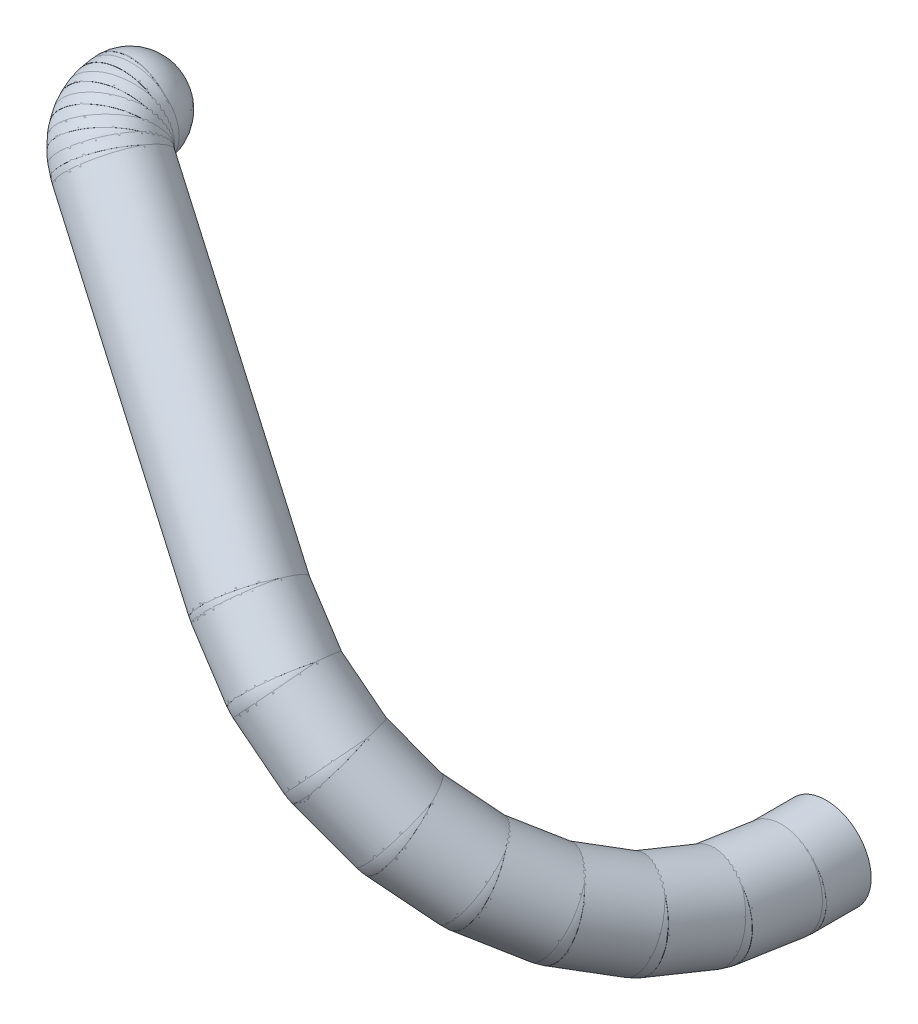
ISO-10303-21;
HEADER;
FILE_DESCRIPTION(('STEP AP214'),'2;1');
FILE_NAME('part.step','',(''),(''),'','','');
FILE_SCHEMA(('AUTOMOTIVE_DESIGN { 1 0 10303 214 1 1 1 1 }'));
ENDSEC;
DATA;
#1=APPLICATION_CONTEXT('core data for automotive mechanical design processes');
#2=APPLICATION_PROTOCOL_DEFINITION('international standard','automotive_design',2000,#1);
#3=PRODUCT_CONTEXT('',#1,'mechanical');
#4=PRODUCT('Part','Part','',(#3));
#5=PRODUCT_RELATED_PRODUCT_CATEGORY('part','',(#4));
#6=PRODUCT_DEFINITION_FORMATION('','',#4);
#7=PRODUCT_DEFINITION_CONTEXT('part definition',#1,'design');
#8=PRODUCT_DEFINITION('design','',#6,#7);
#9=PRODUCT_DEFINITION_SHAPE('','',#8);
#10=(LENGTH_UNIT() NAMED_UNIT(*) SI_UNIT(.MILLI.,.METRE.));
#11=(NAMED_UNIT(*) PLANE_ANGLE_UNIT() SI_UNIT($,.RADIAN.));
#12=(NAMED_UNIT(*) SI_UNIT($,.STERADIAN.) SOLID_ANGLE_UNIT());
#13=UNCERTAINTY_MEASURE_WITH_UNIT(LENGTH_MEASURE(1.E-05),#10,'distance_accuracy_value','');
#14=(GEOMETRIC_REPRESENTATION_CONTEXT(3) GLOBAL_UNCERTAINTY_ASSIGNED_CONTEXT((#13)) GLOBAL_UNIT_ASSIGNED_CONTEXT((#10,
#11,#12)) REPRESENTATION_CONTEXT('',''));
#15=CARTESIAN_POINT('',(0.,0.,0.));
#16=DIRECTION('',(0.,0.,1.));
#17=DIRECTION('',(1.,0.,0.));
#18=AXIS2_PLACEMENT_3D('',#15,#16,#17);
#19=CARTESIAN_POINT('',(51.3,-63.9,201.9));
#20=DIRECTION('',(0.,0.,1.));
#21=DIRECTION('',(1.,0.,0.));
#22=AXIS2_PLACEMENT_3D('',#19,#20,#21);
#23=PLANE('',#22);
#24=CARTESIAN_POINT('',(51.3,-63.9,201.9));
#25=DIRECTION('',(0.,0.,1.));
#26=DIRECTION('',(1.,0.,0.));
#27=AXIS2_PLACEMENT_3D('',#24,#25,#26);
#28=CIRCLE('',#27,2.25);
#29=CARTESIAN_POINT('',(53.55,-63.9,201.9));
#30=VERTEX_POINT('',#29);
#31=EDGE_CURVE('P0_E11',#30,#30,#28,.T.);
#32=ORIENTED_EDGE('',*,*,#31,.F.);
#33=EDGE_LOOP('',(#32));
#34=FACE_BOUND('',#33,.T.);
#35=ADVANCED_FACE('P0_F16',(#34),#23,.F.);
#36=CARTESIAN_POINT('',(51.3,-63.9,204.14956751847));
#37=DIRECTION('',(0.,0.,1.));
#38=DIRECTION('',(1.,0.,0.));
#39=AXIS2_PLACEMENT_3D('',#36,#37,#38);
#40=PLANE('',#39);
#41=CARTESIAN_POINT('',(51.3,-63.9,204.14956751847));
#42=DIRECTION('',(0.,0.,1.));
#43=DIRECTION('',(1.,0.,0.));
#44=AXIS2_PLACEMENT_3D('',#41,#42,#43);
#45=CIRCLE('',#44,2.25);
#46=CARTESIAN_POINT('',(53.55,-63.9,204.14956751847));
#47=VERTEX_POINT('',#46);
#48=EDGE_CURVE('P0_E40',#47,#47,#45,.T.);
#49=ORIENTED_EDGE('',*,*,#48,.T.);
#50=EDGE_LOOP('',(#49));
#51=FACE_BOUND('',#50,.T.);
#52=ADVANCED_FACE('P0_F43',(#51),#40,.T.);
#53=CARTESIAN_POINT('',(51.3,-63.9,201.9));
#54=DIRECTION('',(0.,0.,1.));
#55=DIRECTION('',(1.,0.,0.));
#56=AXIS2_PLACEMENT_3D('',#53,#54,#55);
#57=CYLINDRICAL_SURFACE('',#56,2.25);
#58=ORIENTED_EDGE('',*,*,#48,.F.);
#59=DIRECTION('',(0.,0.,1.));
#60=VECTOR('',#59,1.);
#61=CARTESIAN_POINT('',(53.55,-63.9,201.9));
#62=LINE('',#61,#60);
#63=EDGE_CURVE('P0_E25',#30,#47,#62,.T.);
#64=ORIENTED_EDGE('',*,*,#63,.F.);
#65=ORIENTED_EDGE('',*,*,#31,.T.);
#66=ORIENTED_EDGE('',*,*,#63,.T.);
#67=EDGE_LOOP('',(#58,#64,#65,#66));
#68=FACE_BOUND('',#67,.T.);
#69=ADVANCED_FACE('P0_F18',(#68),#57,.T.);
#70=CLOSED_SHELL('',(#35,#52,#69));
#71=MANIFOLD_SOLID_BREP('P0_B1',#70);
#72=CARTESIAN_POINT('',(51.3,-63.9,204.14956751847));
#73=DIRECTION('',(-0.0848859842823604,0.0789406624260031,0.993258647829536));
#74=DIRECTION('',(0.68099736303441,0.732285867363409,0.));
#75=AXIS2_PLACEMENT_3D('',#72,#73,#74);
#76=PLANE('',#75);
#77=CARTESIAN_POINT('',(51.3,-63.9,204.14956751847));
#78=DIRECTION('',(-0.0848859842824292,0.0789406624260032,0.99325864782953));
#79=DIRECTION('',(0.996367996922374,0.,0.085151715830602));
#80=AXIS2_PLACEMENT_3D('',#77,#78,#79);
#81=CIRCLE('',#80,2.25);
#82=CARTESIAN_POINT('',(53.541827993075,-63.9,204.34115887909));
#83=VERTEX_POINT('',#82);
#84=EDGE_CURVE('P1_E11',#83,#83,#81,.T.);
#85=ORIENTED_EDGE('',*,*,#84,.F.);
#86=EDGE_LOOP('',(#85));
#87=FACE_BOUND('',#86,.T.);
#88=ADVANCED_FACE('P1_F16',(#87),#76,.F.);
#89=CARTESIAN_POINT('',(51.024482393879,-63.64377934683,207.37342416834));
#90=DIRECTION('',(-0.0848859842823604,0.0789406624260031,0.993258647829536));
#91=DIRECTION('',(0.68099736303441,0.732285867363409,0.));
#92=AXIS2_PLACEMENT_3D('',#89,#90,#91);
#93=PLANE('',#92);
#94=CARTESIAN_POINT('',(51.024482393879,-63.64377934683,207.37342416834));
#95=DIRECTION('',(-0.0848859842824292,0.0789406624260032,0.99325864782953));
#96=DIRECTION('',(0.996367996922374,0.,0.085151715830602));
#97=AXIS2_PLACEMENT_3D('',#94,#95,#96);
#98=CIRCLE('',#97,2.25);
#99=CARTESIAN_POINT('',(53.266310386954,-63.64377934683,207.56501552896));
#100=VERTEX_POINT('',#99);
#101=EDGE_CURVE('P1_E41',#100,#100,#98,.T.);
#102=ORIENTED_EDGE('',*,*,#101,.T.);
#103=EDGE_LOOP('',(#102));
#104=FACE_BOUND('',#103,.T.);
#105=ADVANCED_FACE('P1_F18',(#104),#93,.T.);
#106=CARTESIAN_POINT('',(51.3,-63.9,204.14956751847));
#107=DIRECTION('',(-0.0848859842824292,0.0789406624260032,0.99325864782953));
#108=DIRECTION('',(0.996367996922374,0.,0.085151715830602));
#109=AXIS2_PLACEMENT_3D('',#106,#107,#108);
#110=CYLINDRICAL_SURFACE('',#109,2.25);
#111=ORIENTED_EDGE('',*,*,#101,.F.);
#112=DIRECTION('',(-0.0848859842823604,0.0789406624260031,0.993258647829536));
#113=VECTOR('',#112,1.);
#114=CARTESIAN_POINT('',(53.541827993075,-63.9,204.34115887909));
#115=LINE('',#114,#113);
#116=EDGE_CURVE('P1_E25',#83,#100,#115,.T.);
#117=ORIENTED_EDGE('',*,*,#116,.F.);
#118=ORIENTED_EDGE('',*,*,#84,.T.);
#119=ORIENTED_EDGE('',*,*,#116,.T.);
#120=EDGE_LOOP('',(#111,#117,#118,#119));
#121=FACE_BOUND('',#120,.T.);
#122=ADVANCED_FACE('P1_F40',(#121),#110,.T.);
#123=CLOSED_SHELL('',(#88,#105,#122));
#124=MANIFOLD_SOLID_BREP('P1_B1',#123);
#125=CARTESIAN_POINT('',(51.024482393879,-63.64377934683,207.37342416834));
#126=DIRECTION('',(-0.250095413188077,0.232579002926072,0.93987195494929));
#127=DIRECTION('',(0.680997363034739,0.732285867363103,0.));
#128=AXIS2_PLACEMENT_3D('',#125,#126,#127);
#129=PLANE('',#128);
#130=CARTESIAN_POINT('',(51.024482393879,-63.64377934683,207.37342416834));
#131=DIRECTION('',(-0.250095413188084,0.232579002926072,0.939871954949288));
#132=DIRECTION('',(0.966372292231489,0.,0.257147025662864));
#133=AXIS2_PLACEMENT_3D('',#130,#131,#132);
#134=CIRCLE('',#133,2.25);
#135=CARTESIAN_POINT('',(53.1988200514,-63.64377934683,207.95200497608));
#136=VERTEX_POINT('',#135);
#137=EDGE_CURVE('P2_E11',#136,#136,#134,.T.);
#138=ORIENTED_EDGE('',*,*,#137,.F.);
#139=EDGE_LOOP('',(#138));
#140=FACE_BOUND('',#139,.T.);
#141=ADVANCED_FACE('P2_F16',(#140),#129,.F.);
#142=CARTESIAN_POINT('',(50.212738380706,-62.88888899995,210.42400163737));
#143=DIRECTION('',(-0.250095413188077,0.232579002926072,0.93987195494929));
#144=DIRECTION('',(0.680997363034739,0.732285867363103,0.));
#145=AXIS2_PLACEMENT_3D('',#142,#143,#144);
#146=PLANE('',#145);
#147=CARTESIAN_POINT('',(50.212738380706,-62.88888899995,210.42400163737));
#148=DIRECTION('',(-0.250095413188084,0.232579002926072,0.939871954949288));
#149=DIRECTION('',(0.966372292231489,0.,0.257147025662864));
#150=AXIS2_PLACEMENT_3D('',#147,#148,#149);
#151=CIRCLE('',#150,2.25);
#152=CARTESIAN_POINT('',(52.387076038227,-62.88888899995,211.00258244511));
#153=VERTEX_POINT('',#152);
#154=EDGE_CURVE('P2_E20',#153,#153,#151,.T.);
#155=ORIENTED_EDGE('',*,*,#154,.T.);
#156=EDGE_LOOP('',(#155));
#157=FACE_BOUND('',#156,.T.);
#158=ADVANCED_FACE('P2_F18',(#157),#146,.T.);
#159=CARTESIAN_POINT('',(51.024482393879,-63.64377934683,207.37342416834));
#160=DIRECTION('',(-0.250095413188084,0.232579002926072,0.939871954949288));
#161=DIRECTION('',(0.966372292231489,0.,0.257147025662864));
#162=AXIS2_PLACEMENT_3D('',#159,#160,#161);
#163=CYLINDRICAL_SURFACE('',#162,2.25);
#164=ORIENTED_EDGE('',*,*,#154,.F.);
#165=DIRECTION('',(-0.250095413188077,0.232579002926072,0.93987195494929));
#166=VECTOR('',#165,1.);
#167=CARTESIAN_POINT('',(53.1988200514,-63.64377934683,207.95200497608));
#168=LINE('',#167,#166);
#169=EDGE_CURVE('P2_E26',#136,#153,#168,.T.);
#170=ORIENTED_EDGE('',*,*,#169,.F.);
#171=ORIENTED_EDGE('',*,*,#137,.T.);
#172=ORIENTED_EDGE('',*,*,#169,.T.);
#173=EDGE_LOOP('',(#164,#170,#171,#172));
#174=FACE_BOUND('',#173,.T.);
#175=ADVANCED_FACE('P2_F41',(#174),#163,.T.);
#176=CLOSED_SHELL('',(#141,#158,#175));
#177=MANIFOLD_SOLID_BREP('P2_B1',#176);
#178=CARTESIAN_POINT('',(50.212738380706,-62.88888899995,210.42400163737));
#179=DIRECTION('',(-0.401862455214871,0.373716446677879,0.83596805236273));
#180=DIRECTION('',(0.680997363033905,0.732285867363878,0.));
#181=AXIS2_PLACEMENT_3D('',#178,#179,#180);
#182=PLANE('',#181);
#183=CARTESIAN_POINT('',(50.212738380706,-62.88888899995,210.42400163737));
#184=DIRECTION('',(-0.401862455215085,0.373716446677879,0.835968052362627));
#185=DIRECTION('',(0.901271479656326,0.,0.433254797963157));
#186=AXIS2_PLACEMENT_3D('',#183,#184,#185);
#187=CIRCLE('',#186,2.25);
#188=CARTESIAN_POINT('',(52.240599209933,-62.88888899995,211.39882493279));
#189=VERTEX_POINT('',#188);
#190=EDGE_CURVE('P3_E11',#189,#189,#187,.T.);
#191=ORIENTED_EDGE('',*,*,#190,.F.);
#192=EDGE_LOOP('',(#191));
#193=FACE_BOUND('',#192,.T.);
#194=ADVANCED_FACE('P3_F16',(#193),#182,.F.);
#195=CARTESIAN_POINT('',(48.908398417085,-61.67590358631,213.13733433332));
#196=DIRECTION('',(-0.401862455214871,0.373716446677879,0.83596805236273));
#197=DIRECTION('',(0.680997363033905,0.732285867363878,0.));
#198=AXIS2_PLACEMENT_3D('',#195,#196,#197);
#199=PLANE('',#198);
#200=CARTESIAN_POINT('',(48.908398417085,-61.67590358631,213.13733433332));
#201=DIRECTION('',(-0.401862455215085,0.373716446677879,0.835968052362627));
#202=DIRECTION('',(0.901271479656326,0.,0.433254797963157));
#203=AXIS2_PLACEMENT_3D('',#200,#201,#202);
#204=CIRCLE('',#203,2.25);
#205=CARTESIAN_POINT('',(50.936259246312,-61.67590358631,214.11215762873));
#206=VERTEX_POINT('',#205);
#207=EDGE_CURVE('P3_E20',#206,#206,#204,.T.);
#208=ORIENTED_EDGE('',*,*,#207,.T.);
#209=EDGE_LOOP('',(#208));
#210=FACE_BOUND('',#209,.T.);
#211=ADVANCED_FACE('P3_F18',(#210),#199,.T.);
#212=CARTESIAN_POINT('',(50.212738380706,-62.88888899995,210.42400163737));
#213=DIRECTION('',(-0.401862455215085,0.373716446677879,0.835968052362627));
#214=DIRECTION('',(0.901271479656326,0.,0.433254797963157));
#215=AXIS2_PLACEMENT_3D('',#212,#213,#214);
#216=CYLINDRICAL_SURFACE('',#215,2.25);
#217=ORIENTED_EDGE('',*,*,#207,.F.);
#218=DIRECTION('',(-0.401862455214871,0.373716446677879,0.83596805236273));
#219=VECTOR('',#218,1.);
#220=CARTESIAN_POINT('',(52.240599209933,-62.88888899995,211.39882493279));
#221=LINE('',#220,#219);
#222=EDGE_CURVE('P3_E27',#189,#206,#221,.T.);
#223=ORIENTED_EDGE('',*,*,#222,.F.);
#224=ORIENTED_EDGE('',*,*,#190,.T.);
#225=ORIENTED_EDGE('',*,*,#222,.T.);
#226=EDGE_LOOP('',(#217,#223,#224,#225));
#227=FACE_BOUND('',#226,.T.);
#228=ADVANCED_FACE('P3_F41',(#227),#216,.T.);
#229=CLOSED_SHELL('',(#194,#211,#228));
#230=MANIFOLD_SOLID_BREP('P3_B1',#229);
#231=CARTESIAN_POINT('',(48.908398417085,-61.67590358631,213.13733433332));
#232=DIRECTION('',(-0.532029778453992,0.494766992413993,0.687131674466989));
#233=DIRECTION('',(0.680997363034124,0.732285867363675,0.));
#234=AXIS2_PLACEMENT_3D('',#231,#232,#233);
#235=PLANE('',#234);
#236=CARTESIAN_POINT('',(48.908398417085,-61.67590358631,213.13733433332));
#237=DIRECTION('',(-0.532029778453942,0.494766992413992,0.687131674467028));
#238=DIRECTION('',(0.790692029595284,0.,0.61221410824522));
#239=AXIS2_PLACEMENT_3D('',#236,#237,#238);
#240=CIRCLE('',#239,2.25);
#241=CARTESIAN_POINT('',(50.687455483674,-61.67590358631,214.51481607687));
#242=VERTEX_POINT('',#241);
#243=EDGE_CURVE('P4_E11',#242,#242,#240,.T.);
#244=ORIENTED_EDGE('',*,*,#243,.F.);
#245=EDGE_LOOP('',(#244));
#246=FACE_BOUND('',#245,.T.);
#247=ADVANCED_FACE('P4_F16',(#246),#235,.F.);
#248=CARTESIAN_POINT('',(47.181569516128,-60.07001990021,215.36758324472));
#249=DIRECTION('',(-0.532029778453992,0.494766992413993,0.687131674466989));
#250=DIRECTION('',(0.680997363034124,0.732285867363675,0.));
#251=AXIS2_PLACEMENT_3D('',#248,#249,#250);
#252=PLANE('',#251);
#253=CARTESIAN_POINT('',(47.181569516128,-60.07001990021,215.36758324472));
#254=DIRECTION('',(-0.532029778453942,0.494766992413992,0.687131674467028));
#255=DIRECTION('',(0.790692029595284,0.,0.61221410824522));
#256=AXIS2_PLACEMENT_3D('',#253,#254,#255);
#257=CIRCLE('',#256,2.25);
#258=CARTESIAN_POINT('',(48.960626582717,-60.07001990021,216.74506498827));
#259=VERTEX_POINT('',#258);
#260=EDGE_CURVE('P4_E41',#259,#259,#257,.T.);
#261=ORIENTED_EDGE('',*,*,#260,.T.);
#262=EDGE_LOOP('',(#261));
#263=FACE_BOUND('',#262,.T.);
#264=ADVANCED_FACE('P4_F44',(#263),#252,.T.);
#265=CARTESIAN_POINT('',(48.908398417085,-61.67590358631,213.13733433332));
#266=DIRECTION('',(-0.532029778453942,0.494766992413992,0.687131674467028));
#267=DIRECTION('',(0.790692029595284,0.,0.61221410824522));
#268=AXIS2_PLACEMENT_3D('',#265,#266,#267);
#269=CYLINDRICAL_SURFACE('',#268,2.25);
#270=ORIENTED_EDGE('',*,*,#260,.F.);
#271=DIRECTION('',(-0.532029778453992,0.494766992413993,0.687131674466989));
#272=VECTOR('',#271,1.);
#273=CARTESIAN_POINT('',(50.687455483674,-61.67590358631,214.51481607687));
#274=LINE('',#273,#272);
#275=EDGE_CURVE('P4_E19',#242,#259,#274,.T.);
#276=ORIENTED_EDGE('',*,*,#275,.F.);
#277=ORIENTED_EDGE('',*,*,#243,.T.);
#278=ORIENTED_EDGE('',*,*,#275,.T.);
#279=EDGE_LOOP('',(#270,#276,#277,#278));
#280=FACE_BOUND('',#279,.T.);
#281=ADVANCED_FACE('P4_F40',(#280),#269,.T.);
#282=CLOSED_SHELL('',(#247,#264,#281));
#283=MANIFOLD_SOLID_BREP('P4_B1',#282);
#284=CARTESIAN_POINT('',(47.181569516128,-60.07001990021,215.36758324472));
#285=DIRECTION('',(-0.633601015016753,0.58922429022977,0.501362632804804));
#286=DIRECTION('',(0.620521720215387,0.,0.784189259516437));
#287=AXIS2_PLACEMENT_3D('',#284,#285,#286);
#288=PLANE('',#287);
#289=CARTESIAN_POINT('',(47.181569516128,-60.07001990021,215.36758324472));
#290=DIRECTION('',(-0.633601015016876,0.589224290229637,0.501362632804804));
#291=DIRECTION('',(-0.680997363034394,-0.732285867363424,0.));
#292=AXIS2_PLACEMENT_3D('',#289,#290,#291);
#293=CIRCLE('',#292,2.25);
#294=CARTESIAN_POINT('',(45.649325449301,-61.71766310178,215.36758324472));
#295=VERTEX_POINT('',#294);
#296=EDGE_CURVE('P5_E11',#295,#295,#293,.T.);
#297=ORIENTED_EDGE('',*,*,#296,.F.);
#298=EDGE_LOOP('',(#297));
#299=FACE_BOUND('',#298,.T.);
#300=ADVANCED_FACE('P5_F16',(#299),#288,.F.);
#301=CARTESIAN_POINT('',(45.125067063228,-58.15755263856,216.99487464691));
#302=DIRECTION('',(-0.633601015016753,0.58922429022977,0.501362632804804));
#303=DIRECTION('',(0.620521720215387,0.,0.784189259516437));
#304=AXIS2_PLACEMENT_3D('',#301,#302,#303);
#305=PLANE('',#304);
#306=CARTESIAN_POINT('',(45.125067063228,-58.15755263856,216.99487464691));
#307=DIRECTION('',(-0.633601015016876,0.589224290229637,0.501362632804804));
#308=DIRECTION('',(-0.680997363034394,-0.732285867363424,0.));
#309=AXIS2_PLACEMENT_3D('',#306,#307,#308);
#310=CIRCLE('',#309,2.25);
#311=CARTESIAN_POINT('',(43.592822996401,-59.80519584013,216.99487464691));
#312=VERTEX_POINT('',#311);
#313=EDGE_CURVE('P5_E42',#312,#312,#310,.T.);
#314=ORIENTED_EDGE('',*,*,#313,.T.);
#315=EDGE_LOOP('',(#314));
#316=FACE_BOUND('',#315,.T.);
#317=ADVANCED_FACE('P5_F18',(#316),#305,.T.);
#318=CARTESIAN_POINT('',(47.181569516128,-60.07001990021,215.36758324472));
#319=DIRECTION('',(-0.633601015016876,0.589224290229638,0.501362632804804));
#320=DIRECTION('',(-0.680997363034394,-0.732285867363424,0.));
#321=AXIS2_PLACEMENT_3D('',#318,#319,#320);
#322=CYLINDRICAL_SURFACE('',#321,2.25);
#323=ORIENTED_EDGE('',*,*,#313,.F.);
#324=DIRECTION('',(-0.633601015016753,0.58922429022977,0.501362632804804));
#325=VECTOR('',#324,1.);
#326=CARTESIAN_POINT('',(45.649325449301,-61.71766310178,215.36758324472));
#327=LINE('',#326,#325);
#328=EDGE_CURVE('P5_E20',#295,#312,#327,.T.);
#329=ORIENTED_EDGE('',*,*,#328,.F.);
#330=ORIENTED_EDGE('',*,*,#296,.T.);
#331=ORIENTED_EDGE('',*,*,#328,.T.);
#332=EDGE_LOOP('',(#323,#329,#330,#331));
#333=FACE_BOUND('',#332,.T.);
#334=ADVANCED_FACE('P5_F41',(#333),#322,.T.);
#335=CLOSED_SHELL('',(#300,#317,#334));
#336=MANIFOLD_SOLID_BREP('P5_B1',#335);
#337=CARTESIAN_POINT('',(45.125067063228,-58.15755263856,216.99487464691));
#338=DIRECTION('',(-0.701116809050974,0.652011351607976,0.28864583392199));
#339=DIRECTION('',(0.380694183495591,0.,0.924700999595342));
#340=AXIS2_PLACEMENT_3D('',#337,#338,#339);
#341=PLANE('',#340);
#342=CARTESIAN_POINT('',(45.125067063228,-58.15755263856,216.99487464691));
#343=DIRECTION('',(-0.701116809051139,0.652011351607798,0.28864583392199));
#344=DIRECTION('',(-0.680997363034394,-0.732285867363424,0.));
#345=AXIS2_PLACEMENT_3D('',#342,#343,#344);
#346=CIRCLE('',#345,2.25);
#347=CARTESIAN_POINT('',(43.592822996401,-59.80519584013,216.99487464691));
#348=VERTEX_POINT('',#347);
#349=EDGE_CURVE('P6_E11',#348,#348,#346,.T.);
#350=ORIENTED_EDGE('',*,*,#349,.F.);
#351=EDGE_LOOP('',(#350));
#352=FACE_BOUND('',#351,.T.);
#353=ADVANCED_FACE('P6_F16',(#352),#341,.F.);
#354=CARTESIAN_POINT('',(42.849426078744,-56.04129506933,217.93174319891));
#355=DIRECTION('',(-0.701116809050974,0.652011351607976,0.28864583392199));
#356=DIRECTION('',(0.380694183495591,0.,0.924700999595342));
#357=AXIS2_PLACEMENT_3D('',#354,#355,#356);
#358=PLANE('',#357);
#359=CARTESIAN_POINT('',(42.849426078744,-56.04129506933,217.93174319891));
#360=DIRECTION('',(-0.701116809051139,0.652011351607798,0.28864583392199));
#361=DIRECTION('',(-0.680997363034394,-0.732285867363424,0.));
#362=AXIS2_PLACEMENT_3D('',#359,#360,#361);
#363=CIRCLE('',#362,2.25);
#364=CARTESIAN_POINT('',(41.317182011917,-57.6889382709,217.93174319891));
#365=VERTEX_POINT('',#364);
#366=EDGE_CURVE('P6_E19',#365,#365,#363,.T.);
#367=ORIENTED_EDGE('',*,*,#366,.T.);
#368=EDGE_LOOP('',(#367));
#369=FACE_BOUND('',#368,.T.);
#370=ADVANCED_FACE('P6_F44',(#369),#358,.T.);
#371=CARTESIAN_POINT('',(45.125067063228,-58.15755263856,216.99487464691));
#372=DIRECTION('',(-0.701116809051139,0.652011351607798,0.28864583392199));
#373=DIRECTION('',(-0.680997363034394,-0.732285867363424,0.));
#374=AXIS2_PLACEMENT_3D('',#371,#372,#373);
#375=CYLINDRICAL_SURFACE('',#374,2.25);
#376=ORIENTED_EDGE('',*,*,#366,.F.);
#377=DIRECTION('',(-0.701116809050974,0.652011351607976,0.28864583392199));
#378=VECTOR('',#377,1.);
#379=CARTESIAN_POINT('',(43.592822996401,-59.80519584013,216.99487464691));
#380=LINE('',#379,#378);
#381=EDGE_CURVE('P6_E26',#348,#365,#380,.T.);
#382=ORIENTED_EDGE('',*,*,#381,.F.);
#383=ORIENTED_EDGE('',*,*,#349,.T.);
#384=ORIENTED_EDGE('',*,*,#381,.T.);
#385=EDGE_LOOP('',(#376,#382,#383,#384));
#386=FACE_BOUND('',#385,.T.);
#387=ADVANCED_FACE('P6_F40',(#386),#375,.T.);
#388=CLOSED_SHELL('',(#353,#370,#387));
#389=MANIFOLD_SOLID_BREP('P6_B1',#388);
#390=CARTESIAN_POINT('',(42.849426078744,-56.04129506933,217.93174319891));
#391=DIRECTION('',(-0.730948251844201,0.679753432649187,0.0604146002846466));
#392=DIRECTION('',(0.0823714851132162,0.,0.996601694981623));
#393=AXIS2_PLACEMENT_3D('',#390,#391,#392);
#394=PLANE('',#393);
#395=CARTESIAN_POINT('',(42.849426078744,-56.04129506933,217.93174319891));
#396=DIRECTION('',(-0.730948251844387,0.679753432648987,0.0604146002846466));
#397=DIRECTION('',(-0.680997363034394,-0.732285867363424,0.));
#398=AXIS2_PLACEMENT_3D('',#395,#396,#397);
#399=CIRCLE('',#398,2.25);
#400=CARTESIAN_POINT('',(41.317182011917,-57.6889382709,217.93174319891));
#401=VERTEX_POINT('',#400);
#402=EDGE_CURVE('P7_E11',#401,#401,#399,.T.);
#403=ORIENTED_EDGE('',*,*,#402,.F.);
#404=EDGE_LOOP('',(#403));
#405=FACE_BOUND('',#404,.T.);
#406=ADVANCED_FACE('P7_F16',(#405),#394,.F.);
#407=CARTESIAN_POINT('',(40.476960067431,-53.83499399266,218.127833121));
#408=DIRECTION('',(-0.730948251844201,0.679753432649187,0.0604146002846466));
#409=DIRECTION('',(0.0823714851132162,0.,0.996601694981623));
#410=AXIS2_PLACEMENT_3D('',#407,#408,#409);
#411=PLANE('',#410);
#412=CARTESIAN_POINT('',(40.476960067431,-53.83499399266,218.127833121));
#413=DIRECTION('',(-0.730948251844387,0.679753432648987,0.0604146002846466));
#414=DIRECTION('',(-0.680997363034394,-0.732285867363424,0.));
#415=AXIS2_PLACEMENT_3D('',#412,#413,#414);
#416=CIRCLE('',#415,2.25);
#417=CARTESIAN_POINT('',(38.944716000604,-55.48263719423,218.127833121));
#418=VERTEX_POINT('',#417);
#419=EDGE_CURVE('P7_E41',#418,#418,#416,.T.);
#420=ORIENTED_EDGE('',*,*,#419,.T.);
#421=EDGE_LOOP('',(#420));
#422=FACE_BOUND('',#421,.T.);
#423=ADVANCED_FACE('P7_F18',(#422),#411,.T.);
#424=CARTESIAN_POINT('',(42.849426078744,-56.04129506933,217.93174319891));
#425=DIRECTION('',(-0.730948251844387,0.679753432648987,0.0604146002846466));
#426=DIRECTION('',(-0.680997363034394,-0.732285867363424,0.));
#427=AXIS2_PLACEMENT_3D('',#424,#425,#426);
#428=CYLINDRICAL_SURFACE('',#427,2.25);
#429=ORIENTED_EDGE('',*,*,#419,.F.);
#430=DIRECTION('',(-0.730948251844201,0.679753432649187,0.0604146002846466));
#431=VECTOR('',#430,1.);
#432=CARTESIAN_POINT('',(41.317182011917,-57.6889382709,217.93174319891));
#433=LINE('',#432,#431);
#434=EDGE_CURVE('P7_E20',#401,#418,#433,.T.);
#435=ORIENTED_EDGE('',*,*,#434,.F.);
#436=ORIENTED_EDGE('',*,*,#402,.T.);
#437=ORIENTED_EDGE('',*,*,#434,.T.);
#438=EDGE_LOOP('',(#429,#435,#436,#437));
#439=FACE_BOUND('',#438,.T.);
#440=ADVANCED_FACE('P7_F40',(#439),#428,.T.);
#441=CLOSED_SHELL('',(#406,#423,#440));
#442=MANIFOLD_SOLID_BREP('P7_B1',#441);
#443=CARTESIAN_POINT('',(40.476960067431,-53.83499399266,218.127833121));
#444=DIRECTION('',(-0.721491932162164,0.670959423295152,-0.171063859761039));
#445=DIRECTION('',(-0.230701589176399,0.,0.973024550950018));
#446=AXIS2_PLACEMENT_3D('',#443,#444,#445);
#447=PLANE('',#446);
#448=CARTESIAN_POINT('',(40.476960067431,-53.83499399266,218.127833121));
#449=DIRECTION('',(-0.721491932162388,0.670959423294911,-0.171063859761039));
#450=DIRECTION('',(-0.680997363034394,-0.732285867363424,0.));
#451=AXIS2_PLACEMENT_3D('',#448,#449,#450);
#452=CIRCLE('',#451,2.25);
#453=CARTESIAN_POINT('',(38.944716000604,-55.48263719423,218.127833121));
#454=VERTEX_POINT('',#453);
#455=EDGE_CURVE('P8_E11',#454,#454,#452,.T.);
#456=ORIENTED_EDGE('',*,*,#455,.F.);
#457=EDGE_LOOP('',(#456));
#458=FACE_BOUND('',#457,.T.);
#459=ADVANCED_FACE('P8_F16',(#458),#447,.F.);
#460=CARTESIAN_POINT('',(38.135186785707,-51.65723596024,217.57260476931));
#461=DIRECTION('',(-0.721491932162164,0.670959423295152,-0.171063859761039));
#462=DIRECTION('',(-0.230701589176399,0.,0.973024550950018));
#463=AXIS2_PLACEMENT_3D('',#460,#461,#462);
#464=PLANE('',#463);
#465=CARTESIAN_POINT('',(38.135186785707,-51.65723596024,217.57260476931));
#466=DIRECTION('',(-0.721491932162388,0.670959423294911,-0.171063859761039));
#467=DIRECTION('',(-0.680997363034394,-0.732285867363424,0.));
#468=AXIS2_PLACEMENT_3D('',#465,#466,#467);
#469=CIRCLE('',#468,2.25);
#470=CARTESIAN_POINT('',(36.60294271888,-53.30487916181,217.57260476931));
#471=VERTEX_POINT('',#470);
#472=EDGE_CURVE('P8_E40',#471,#471,#469,.T.);
#473=ORIENTED_EDGE('',*,*,#472,.T.);
#474=EDGE_LOOP('',(#473));
#475=FACE_BOUND('',#474,.T.);
#476=ADVANCED_FACE('P8_F44',(#475),#464,.T.);
#477=CARTESIAN_POINT('',(40.476960067431,-53.83499399266,218.127833121));
#478=DIRECTION('',(-0.721491932162388,0.670959423294911,-0.171063859761039));
#479=DIRECTION('',(-0.680997363034394,-0.732285867363424,0.));
#480=AXIS2_PLACEMENT_3D('',#477,#478,#479);
#481=CYLINDRICAL_SURFACE('',#480,2.25);
#482=ORIENTED_EDGE('',*,*,#472,.F.);
#483=DIRECTION('',(-0.721491932162164,0.670959423295152,-0.171063859761039));
#484=VECTOR('',#483,1.);
#485=CARTESIAN_POINT('',(38.944716000604,-55.48263719423,218.127833121));
#486=LINE('',#485,#484);
#487=EDGE_CURVE('P8_E25',#454,#471,#486,.T.);
#488=ORIENTED_EDGE('',*,*,#487,.F.);
#489=ORIENTED_EDGE('',*,*,#455,.T.);
#490=ORIENTED_EDGE('',*,*,#487,.T.);
#491=EDGE_LOOP('',(#482,#488,#489,#490));
#492=FACE_BOUND('',#491,.T.);
#493=ADVANCED_FACE('P8_F18',(#492),#481,.T.);
#494=CLOSED_SHELL('',(#459,#476,#493));
#495=MANIFOLD_SOLID_BREP('P8_B1',#494);
#496=CARTESIAN_POINT('',(38.135186785707,-51.65723596024,217.57260476931));
#497=DIRECTION('',(-0.702107176848657,0.652932355123681,-0.284121192187862));
#498=DIRECTION('',(-0.375118966796803,0.,0.926976677564921));
#499=AXIS2_PLACEMENT_3D('',#496,#497,#498);
#500=PLANE('',#499);
#501=CARTESIAN_POINT('',(38.135186785707,-51.65723596024,217.57260476931));
#502=DIRECTION('',(-0.702107176848609,0.652932355123733,-0.284121192187862));
#503=DIRECTION('',(-0.680997363034394,-0.732285867363424,0.));
#504=AXIS2_PLACEMENT_3D('',#501,#502,#503);
#505=CIRCLE('',#504,2.25);
#506=CARTESIAN_POINT('',(36.60294271888,-53.30487916181,217.57260476931));
#507=VERTEX_POINT('',#506);
#508=EDGE_CURVE('P9_E11',#507,#507,#505,.T.);
#509=ORIENTED_EDGE('',*,*,#508,.F.);
#510=EDGE_LOOP('',(#509));
#511=FACE_BOUND('',#510,.T.);
#512=ADVANCED_FACE('P9_F16',(#511),#500,.F.);
#513=CARTESIAN_POINT('',(26.632097549967,-40.95981056203,212.91765815251));
#514=DIRECTION('',(-0.702107176848657,0.652932355123681,-0.284121192187862));
#515=DIRECTION('',(-0.375118966796803,0.,0.926976677564921));
#516=AXIS2_PLACEMENT_3D('',#513,#514,#515);
#517=PLANE('',#516);
#518=CARTESIAN_POINT('',(26.632097549967,-40.95981056203,212.91765815251));
#519=DIRECTION('',(-0.702107176848609,0.652932355123733,-0.284121192187862));
#520=DIRECTION('',(-0.680997363034394,-0.732285867363424,0.));
#521=AXIS2_PLACEMENT_3D('',#518,#519,#520);
#522=CIRCLE('',#521,2.25);
#523=CARTESIAN_POINT('',(25.09985348314,-42.6074537636,212.91765815251));
#524=VERTEX_POINT('',#523);
#525=EDGE_CURVE('P9_E41',#524,#524,#522,.T.);
#526=ORIENTED_EDGE('',*,*,#525,.T.);
#527=EDGE_LOOP('',(#526));
#528=FACE_BOUND('',#527,.T.);
#529=ADVANCED_FACE('P9_F18',(#528),#517,.T.);
#530=CARTESIAN_POINT('',(38.135186785707,-51.65723596024,217.57260476931));
#531=DIRECTION('',(-0.702107176848609,0.652932355123733,-0.284121192187862));
#532=DIRECTION('',(-0.680997363034394,-0.732285867363424,0.));
#533=AXIS2_PLACEMENT_3D('',#530,#531,#532);
#534=CYLINDRICAL_SURFACE('',#533,2.25);
#535=ORIENTED_EDGE('',*,*,#525,.F.);
#536=DIRECTION('',(-0.702107176848657,0.652932355123681,-0.284121192187862));
#537=VECTOR('',#536,1.);
#538=CARTESIAN_POINT('',(36.60294271888,-53.30487916181,217.57260476931));
#539=LINE('',#538,#537);
#540=EDGE_CURVE('P9_E25',#507,#524,#539,.T.);
#541=ORIENTED_EDGE('',*,*,#540,.F.);
#542=ORIENTED_EDGE('',*,*,#508,.T.);
#543=ORIENTED_EDGE('',*,*,#540,.T.);
#544=EDGE_LOOP('',(#535,#541,#542,#543));
#545=FACE_BOUND('',#544,.T.);
#546=ADVANCED_FACE('P9_F40',(#545),#534,.T.);
#547=CLOSED_SHELL('',(#512,#529,#546));
#548=MANIFOLD_SOLID_BREP('P9_B1',#547);
#549=CARTESIAN_POINT('',(26.632097549967,-40.95981056203,212.91765815251));
#550=DIRECTION('',(-0.669724475241128,0.622817702656119,-0.404434465051077));
#551=DIRECTION('',(-0.516937025063928,0.,0.856023429654853));
#552=AXIS2_PLACEMENT_3D('',#549,#550,#551);
#553=PLANE('',#552);
#554=CARTESIAN_POINT('',(26.632097549967,-40.95981056203,212.91765815251));
#555=DIRECTION('',(-0.669724475241148,0.622817702656097,-0.404434465051077));
#556=DIRECTION('',(-0.680997363034394,-0.732285867363424,0.));
#557=AXIS2_PLACEMENT_3D('',#554,#555,#556);
#558=CIRCLE('',#557,2.25);
#559=CARTESIAN_POINT('',(25.09985348314,-42.6074537636,212.91765815251));
#560=VERTEX_POINT('',#559);
#561=EDGE_CURVE('P10_E11',#560,#560,#558,.T.);
#562=ORIENTED_EDGE('',*,*,#561,.F.);
#563=EDGE_LOOP('',(#562));
#564=FACE_BOUND('',#563,.T.);
#565=ADVANCED_FACE('P10_F16',(#564),#553,.F.);
#566=CARTESIAN_POINT('',(26.294761700069,-40.64610134753,212.71394715039));
#567=DIRECTION('',(-0.669724475241128,0.622817702656119,-0.404434465051077));
#568=DIRECTION('',(-0.516937025063928,0.,0.856023429654853));
#569=AXIS2_PLACEMENT_3D('',#566,#567,#568);
#570=PLANE('',#569);
#571=CARTESIAN_POINT('',(26.294761700069,-40.64610134753,212.71394715039));
#572=DIRECTION('',(-0.669724475241148,0.622817702656097,-0.404434465051077));
#573=DIRECTION('',(-0.680997363034394,-0.732285867363424,0.));
#574=AXIS2_PLACEMENT_3D('',#571,#572,#573);
#575=CIRCLE('',#574,2.25);
#576=CARTESIAN_POINT('',(24.762517633241,-42.2937445491,212.71394715039));
#577=VERTEX_POINT('',#576);
#578=EDGE_CURVE('P10_E40',#577,#577,#575,.T.);
#579=ORIENTED_EDGE('',*,*,#578,.T.);
#580=EDGE_LOOP('',(#579));
#581=FACE_BOUND('',#580,.T.);
#582=ADVANCED_FACE('P10_F43',(#581),#570,.T.);
#583=CARTESIAN_POINT('',(26.632097549967,-40.95981056203,212.91765815251));
#584=DIRECTION('',(-0.669724475241148,0.622817702656097,-0.404434465051077));
#585=DIRECTION('',(-0.680997363034394,-0.732285867363424,0.));
#586=AXIS2_PLACEMENT_3D('',#583,#584,#585);
#587=CYLINDRICAL_SURFACE('',#586,2.25);
#588=ORIENTED_EDGE('',*,*,#578,.F.);
#589=DIRECTION('',(-0.669724475241128,0.622817702656119,-0.404434465051077));
#590=VECTOR('',#589,1.);
#591=CARTESIAN_POINT('',(25.09985348314,-42.6074537636,212.91765815251));
#592=LINE('',#591,#590);
#593=EDGE_CURVE('P10_E25',#560,#577,#592,.T.);
#594=ORIENTED_EDGE('',*,*,#593,.F.);
#595=ORIENTED_EDGE('',*,*,#561,.T.);
#596=ORIENTED_EDGE('',*,*,#593,.T.);
#597=EDGE_LOOP('',(#588,#594,#595,#596));
#598=FACE_BOUND('',#597,.T.);
#599=ADVANCED_FACE('P10_F39',(#598),#587,.T.);
#600=CLOSED_SHELL('',(#565,#582,#599));
#601=MANIFOLD_SOLID_BREP('P10_B1',#600);
#602=CARTESIAN_POINT('',(26.294761700069,-40.64610134753,212.71394715039));
#603=DIRECTION('',(-0.572659595433036,0.532551141278033,-0.623257787502039));
#604=DIRECTION('',(-0.736365060799857,0.,0.676584434666674));
#605=AXIS2_PLACEMENT_3D('',#602,#603,#604);
#606=PLANE('',#605);
#607=CARTESIAN_POINT('',(26.294761700069,-40.64610134753,212.71394715039));
#608=DIRECTION('',(-0.572659595433125,0.532551141278033,-0.623257787501957));
#609=DIRECTION('',(-0.73636506079976,0.,0.67658443466678));
#610=AXIS2_PLACEMENT_3D('',#607,#608,#609);
#611=CIRCLE('',#610,2.25);
#612=CARTESIAN_POINT('',(24.63794031327,-40.64610134753,214.23626212839));
#613=VERTEX_POINT('',#612);
#614=EDGE_CURVE('P11_E11',#613,#613,#611,.T.);
#615=ORIENTED_EDGE('',*,*,#614,.F.);
#616=EDGE_LOOP('',(#615));
#617=FACE_BOUND('',#616,.T.);
#618=ADVANCED_FACE('P11_F16',(#617),#606,.F.);
#619=CARTESIAN_POINT('',(26.006316797024,-40.37785881124,212.40001626803));
#620=DIRECTION('',(-0.572659595433036,0.532551141278033,-0.623257787502039));
#621=DIRECTION('',(-0.736365060799857,0.,0.676584434666674));
#622=AXIS2_PLACEMENT_3D('',#619,#620,#621);
#623=PLANE('',#622);
#624=CARTESIAN_POINT('',(26.006316797024,-40.37785881124,212.40001626803));
#625=DIRECTION('',(-0.572659595433125,0.532551141278033,-0.623257787501957));
#626=DIRECTION('',(-0.73636506079976,0.,0.67658443466678));
#627=AXIS2_PLACEMENT_3D('',#624,#625,#626);
#628=CIRCLE('',#627,2.25);
#629=CARTESIAN_POINT('',(24.349495410224,-40.37785881124,213.92233124603));
#630=VERTEX_POINT('',#629);
#631=EDGE_CURVE('P11_E20',#630,#630,#628,.T.);
#632=ORIENTED_EDGE('',*,*,#631,.T.);
#633=EDGE_LOOP('',(#632));
#634=FACE_BOUND('',#633,.T.);
#635=ADVANCED_FACE('P11_F18',(#634),#623,.T.);
#636=CARTESIAN_POINT('',(26.294761700069,-40.64610134753,212.71394715039));
#637=DIRECTION('',(-0.572659595433125,0.532551141278033,-0.623257787501957));
#638=DIRECTION('',(-0.73636506079976,0.,0.67658443466678));
#639=AXIS2_PLACEMENT_3D('',#636,#637,#638);
#640=CYLINDRICAL_SURFACE('',#639,2.25);
#641=ORIENTED_EDGE('',*,*,#631,.F.);
#642=DIRECTION('',(-0.572659595433036,0.532551141278033,-0.623257787502039));
#643=VECTOR('',#642,1.);
#644=CARTESIAN_POINT('',(24.63794031327,-40.64610134753,214.23626212839));
#645=LINE('',#644,#643);
#646=EDGE_CURVE('P11_E26',#613,#630,#645,.T.);
#647=ORIENTED_EDGE('',*,*,#646,.F.);
#648=ORIENTED_EDGE('',*,*,#614,.T.);
#649=ORIENTED_EDGE('',*,*,#646,.T.);
#650=EDGE_LOOP('',(#641,#647,#648,#649));
#651=FACE_BOUND('',#650,.T.);
#652=ADVANCED_FACE('P11_F41',(#651),#640,.T.);
#653=CLOSED_SHELL('',(#618,#635,#652));
#654=MANIFOLD_SOLID_BREP('P11_B1',#653);
#655=CARTESIAN_POINT('',(26.006316797024,-40.37785881124,212.40001626803));
#656=DIRECTION('',(-0.438112261372975,0.407427355906977,-0.801286837588955));
#657=DIRECTION('',(-0.877413304582357,0.,0.479735232124834));
#658=AXIS2_PLACEMENT_3D('',#655,#656,#657);
#659=PLANE('',#658);
#660=CARTESIAN_POINT('',(26.006316797024,-40.37785881124,212.40001626803));
#661=DIRECTION('',(-0.438112261372141,0.407427355906977,-0.80128683758941));
#662=DIRECTION('',(-0.877413304582856,0.,0.479735232123921));
#663=AXIS2_PLACEMENT_3D('',#660,#661,#662);
#664=CIRCLE('',#663,2.25);
#665=CARTESIAN_POINT('',(24.032136861713,-40.37785881124,213.47942054031));
#666=VERTEX_POINT('',#665);
#667=EDGE_CURVE('P12_E11',#666,#666,#664,.T.);
#668=ORIENTED_EDGE('',*,*,#667,.F.);
#669=EDGE_LOOP('',(#668));
#670=FACE_BOUND('',#669,.T.);
#671=ADVANCED_FACE('P12_F16',(#670),#659,.F.);
#672=CARTESIAN_POINT('',(25.785642508559,-40.17264030951,211.99641331433));
#673=DIRECTION('',(-0.438112261372975,0.407427355906977,-0.801286837588955));
#674=DIRECTION('',(-0.877413304582357,0.,0.479735232124834));
#675=AXIS2_PLACEMENT_3D('',#672,#673,#674);
#676=PLANE('',#675);
#677=CARTESIAN_POINT('',(25.785642508559,-40.17264030951,211.99641331433));
#678=DIRECTION('',(-0.438112261372141,0.407427355906977,-0.80128683758941));
#679=DIRECTION('',(-0.877413304582856,0.,0.479735232123921));
#680=AXIS2_PLACEMENT_3D('',#677,#678,#679);
#681=CIRCLE('',#680,2.25);
#682=CARTESIAN_POINT('',(23.811462573248,-40.17264030951,213.07581758661));
#683=VERTEX_POINT('',#682);
#684=EDGE_CURVE('P12_E41',#683,#683,#681,.T.);
#685=ORIENTED_EDGE('',*,*,#684,.T.);
#686=EDGE_LOOP('',(#685));
#687=FACE_BOUND('',#686,.T.);
#688=ADVANCED_FACE('P12_F18',(#687),#676,.T.);
#689=CARTESIAN_POINT('',(26.006316797024,-40.37785881124,212.40001626803));
#690=DIRECTION('',(-0.438112261372141,0.407427355906977,-0.80128683758941));
#691=DIRECTION('',(-0.877413304582856,0.,0.479735232123921));
#692=AXIS2_PLACEMENT_3D('',#689,#690,#691);
#693=CYLINDRICAL_SURFACE('',#692,2.25);
#694=ORIENTED_EDGE('',*,*,#684,.F.);
#695=DIRECTION('',(-0.438112261372975,0.407427355906977,-0.801286837588954));
#696=VECTOR('',#695,1.);
#697=CARTESIAN_POINT('',(24.032136861713,-40.37785881124,213.47942054031));
#698=LINE('',#697,#696);
#699=EDGE_CURVE('P12_E26',#666,#683,#698,.T.);
#700=ORIENTED_EDGE('',*,*,#699,.F.);
#701=ORIENTED_EDGE('',*,*,#667,.T.);
#702=ORIENTED_EDGE('',*,*,#699,.T.);
#703=EDGE_LOOP('',(#694,#700,#701,#702));
#704=FACE_BOUND('',#703,.T.);
#705=ADVANCED_FACE('P12_F40',(#704),#693,.T.);
#706=CLOSED_SHELL('',(#671,#688,#705));
#707=MANIFOLD_SOLID_BREP('P12_B1',#706);
#708=CARTESIAN_POINT('',(25.785642508559,-40.17264030951,211.99641331433));
#709=DIRECTION('',(-0.274889038658977,0.255636109881979,-0.926869028368923));
#710=DIRECTION('',(-0.958724494869121,0.,0.28433667181345));
#711=AXIS2_PLACEMENT_3D('',#708,#709,#710);
#712=PLANE('',#711);
#713=CARTESIAN_POINT('',(25.785642508559,-40.17264030951,211.99641331433));
#714=DIRECTION('',(-0.274889038659497,0.255636109881979,-0.926869028368769));
#715=DIRECTION('',(-0.958724494868961,0.,0.284336671813988));
#716=AXIS2_PLACEMENT_3D('',#713,#714,#715);
#717=CIRCLE('',#716,2.25);
#718=CARTESIAN_POINT('',(23.628512395104,-40.17264030951,212.63617082591));
#719=VERTEX_POINT('',#718);
#720=EDGE_CURVE('P13_E11',#719,#719,#717,.T.);
#721=ORIENTED_EDGE('',*,*,#720,.F.);
#722=EDGE_LOOP('',(#721));
#723=FACE_BOUND('',#722,.T.);
#724=ADVANCED_FACE('P13_F16',(#723),#712,.F.);
#725=CARTESIAN_POINT('',(25.647182692751,-40.04387806835,211.52955543025));
#726=DIRECTION('',(-0.274889038658977,0.255636109881979,-0.926869028368923));
#727=DIRECTION('',(-0.958724494869121,0.,0.28433667181345));
#728=AXIS2_PLACEMENT_3D('',#725,#726,#727);
#729=PLANE('',#728);
#730=CARTESIAN_POINT('',(25.647182692751,-40.04387806835,211.52955543025));
#731=DIRECTION('',(-0.274889038659497,0.255636109881979,-0.926869028368769));
#732=DIRECTION('',(-0.958724494868961,0.,0.284336671813988));
#733=AXIS2_PLACEMENT_3D('',#730,#731,#732);
#734=CIRCLE('',#733,2.25);
#735=CARTESIAN_POINT('',(23.490052579296,-40.04387806835,212.16931294183));
#736=VERTEX_POINT('',#735);
#737=EDGE_CURVE('P13_E40',#736,#736,#734,.T.);
#738=ORIENTED_EDGE('',*,*,#737,.T.);
#739=EDGE_LOOP('',(#738));
#740=FACE_BOUND('',#739,.T.);
#741=ADVANCED_FACE('P13_F43',(#740),#729,.T.);
#742=CARTESIAN_POINT('',(25.785642508559,-40.17264030951,211.99641331433));
#743=DIRECTION('',(-0.274889038659497,0.255636109881979,-0.926869028368769));
#744=DIRECTION('',(-0.958724494868961,0.,0.284336671813988));
#745=AXIS2_PLACEMENT_3D('',#742,#743,#744);
#746=CYLINDRICAL_SURFACE('',#745,2.25);
#747=ORIENTED_EDGE('',*,*,#737,.F.);
#748=DIRECTION('',(-0.274889038658977,0.255636109881979,-0.926869028368923));
#749=VECTOR('',#748,1.);
#750=CARTESIAN_POINT('',(23.628512395104,-40.17264030951,212.63617082591));
#751=LINE('',#750,#749);
#752=EDGE_CURVE('P13_E25',#719,#736,#751,.T.);
#753=ORIENTED_EDGE('',*,*,#752,.F.);
#754=ORIENTED_EDGE('',*,*,#720,.T.);
#755=ORIENTED_EDGE('',*,*,#752,.T.);
#756=EDGE_LOOP('',(#747,#753,#754,#755));
#757=FACE_BOUND('',#756,.T.);
#758=ADVANCED_FACE('P13_F18',(#757),#746,.T.);
#759=CLOSED_SHELL('',(#724,#741,#758));
#760=MANIFOLD_SOLID_BREP('P13_B1',#759);
#761=CARTESIAN_POINT('',(25.647182692751,-40.04387806835,211.52955543025));
#762=DIRECTION('',(-0.0936734241341872,0.087112639564486,-0.991784592358182));
#763=DIRECTION('',(-0.995569280645613,0.,0.0940308855364876));
#764=AXIS2_PLACEMENT_3D('',#761,#762,#763);
#765=PLANE('',#764);
#766=CARTESIAN_POINT('',(25.647182692751,-40.04387806835,211.52955543025));
#767=DIRECTION('',(-0.0936734241341338,0.087112639564486,-0.991784592358187));
#768=DIRECTION('',(-0.995569280645618,0.,0.094030885536434));
#769=AXIS2_PLACEMENT_3D('',#766,#767,#768);
#770=CIRCLE('',#769,2.25);
#771=CARTESIAN_POINT('',(23.407151811298,-40.04387806835,211.7411249227));
#772=VERTEX_POINT('',#771);
#773=EDGE_CURVE('P14_E11',#772,#772,#770,.T.);
#774=ORIENTED_EDGE('',*,*,#773,.F.);
#775=EDGE_LOOP('',(#774));
#776=FACE_BOUND('',#775,.T.);
#777=ADVANCED_FACE('P14_F16',(#776),#765,.F.);
#778=CARTESIAN_POINT('',(25.6,-40.,211.03));
#779=DIRECTION('',(-0.0936734241341872,0.087112639564486,-0.991784592358182));
#780=DIRECTION('',(-0.995569280645613,0.,0.0940308855364876));
#781=AXIS2_PLACEMENT_3D('',#778,#779,#780);
#782=PLANE('',#781);
#783=CARTESIAN_POINT('',(25.6,-40.,211.03));
#784=DIRECTION('',(-0.0936734241341338,0.087112639564486,-0.991784592358187));
#785=DIRECTION('',(-0.995569280645618,0.,0.094030885536434));
#786=AXIS2_PLACEMENT_3D('',#783,#784,#785);
#787=CIRCLE('',#786,2.25);
#788=CARTESIAN_POINT('',(23.359969118547,-40.,211.24156949245));
#789=VERTEX_POINT('',#788);
#790=EDGE_CURVE('P14_E20',#789,#789,#787,.T.);
#791=ORIENTED_EDGE('',*,*,#790,.T.);
#792=EDGE_LOOP('',(#791));
#793=FACE_BOUND('',#792,.T.);
#794=ADVANCED_FACE('P14_F44',(#793),#782,.T.);
#795=CARTESIAN_POINT('',(25.647182692751,-40.04387806835,211.52955543025));
#796=DIRECTION('',(-0.0936734241341338,0.087112639564486,-0.991784592358187));
#797=DIRECTION('',(-0.995569280645618,0.,0.094030885536434));
#798=AXIS2_PLACEMENT_3D('',#795,#796,#797);
#799=CYLINDRICAL_SURFACE('',#798,2.25);
#800=ORIENTED_EDGE('',*,*,#790,.F.);
#801=DIRECTION('',(-0.0936734241341872,0.087112639564486,-0.991784592358182));
#802=VECTOR('',#801,1.);
#803=CARTESIAN_POINT('',(23.407151811298,-40.04387806835,211.7411249227));
#804=LINE('',#803,#802);
#805=EDGE_CURVE('P14_E27',#772,#789,#804,.T.);
#806=ORIENTED_EDGE('',*,*,#805,.F.);
#807=ORIENTED_EDGE('',*,*,#773,.T.);
#808=ORIENTED_EDGE('',*,*,#805,.T.);
#809=EDGE_LOOP('',(#800,#806,#807,#808));
#810=FACE_BOUND('',#809,.T.);
#811=ADVANCED_FACE('P14_F18',(#810),#799,.T.);
#812=CLOSED_SHELL('',(#777,#794,#811));
#813=MANIFOLD_SOLID_BREP('P14_B1',#812);
#814=CARTESIAN_POINT('',(25.6,-40.,211.03));
#815=DIRECTION('',(0.,0.,-1.));
#816=DIRECTION('',(0.,-1.,0.));
#817=AXIS2_PLACEMENT_3D('',#814,#815,#816);
#818=PLANE('',#817);
#819=CARTESIAN_POINT('',(25.6,-40.,211.03));
#820=DIRECTION('',(0.,0.,-1.));
#821=DIRECTION('',(-1.,0.,0.));
#822=AXIS2_PLACEMENT_3D('',#819,#820,#821);
#823=CIRCLE('',#822,2.25);
#824=CARTESIAN_POINT('',(23.35,-40.,211.03));
#825=VERTEX_POINT('',#824);
#826=EDGE_CURVE('P15_E11',#825,#825,#823,.T.);
#827=ORIENTED_EDGE('',*,*,#826,.F.);
#828=EDGE_LOOP('',(#827));
#829=FACE_BOUND('',#828,.T.);
#830=ADVANCED_FACE('P15_F16',(#829),#818,.F.);
#831=CARTESIAN_POINT('',(25.6,-40.,211.));
#832=DIRECTION('',(0.,0.,-1.));
#833=DIRECTION('',(0.,-1.,0.));
#834=AXIS2_PLACEMENT_3D('',#831,#832,#833);
#835=PLANE('',#834);
#836=CARTESIAN_POINT('',(25.6,-40.,211.));
#837=DIRECTION('',(0.,0.,-1.));
#838=DIRECTION('',(-1.,0.,0.));
#839=AXIS2_PLACEMENT_3D('',#836,#837,#838);
#840=CIRCLE('',#839,2.25);
#841=CARTESIAN_POINT('',(23.35,-40.,211.));
#842=VERTEX_POINT('',#841);
#843=EDGE_CURVE('P15_E40',#842,#842,#840,.T.);
#844=ORIENTED_EDGE('',*,*,#843,.T.);
#845=EDGE_LOOP('',(#844));
#846=FACE_BOUND('',#845,.T.);
#847=ADVANCED_FACE('P15_F44',(#846),#835,.T.);
#848=CARTESIAN_POINT('',(25.6,-40.,211.03));
#849=DIRECTION('',(0.,0.,-1.));
#850=DIRECTION('',(-1.,0.,0.));
#851=AXIS2_PLACEMENT_3D('',#848,#849,#850);
#852=CYLINDRICAL_SURFACE('',#851,2.25);
#853=ORIENTED_EDGE('',*,*,#843,.F.);
#854=DIRECTION('',(0.,0.,-1.));
#855=VECTOR('',#854,1.);
#856=CARTESIAN_POINT('',(23.35,-40.,211.03));
#857=LINE('',#856,#855);
#858=EDGE_CURVE('P15_E24',#825,#842,#857,.T.);
#859=ORIENTED_EDGE('',*,*,#858,.F.);
#860=ORIENTED_EDGE('',*,*,#826,.T.);
#861=ORIENTED_EDGE('',*,*,#858,.T.);
#862=EDGE_LOOP('',(#853,#859,#860,#861));
#863=FACE_BOUND('',#862,.T.);
#864=ADVANCED_FACE('P15_F39',(#863),#852,.T.);
#865=CLOSED_SHELL('',(#830,#847,#864));
#866=MANIFOLD_SOLID_BREP('P15_B1',#865);
#867=CARTESIAN_POINT('',(51.3,-63.9,204.14956751847));
#868=DIRECTION('',(0.,0.,1.));
#869=DIRECTION('',(1.,0.,0.));
#870=AXIS2_PLACEMENT_3D('',#867,#868,#869);
#871=SPHERICAL_SURFACE('',#870,2.25);
#872=CARTESIAN_POINT('',(51.3,-63.9,201.89956751847));
#873=VERTEX_POINT('',#872);
#874=VERTEX_LOOP('',#873);
#875=FACE_BOUND('',#874,.T.);
#876=ADVANCED_FACE('P16_F14',(#875),#871,.T.);
#877=CLOSED_SHELL('',(#876));
#878=MANIFOLD_SOLID_BREP('P16_B1',#877);
#879=CARTESIAN_POINT('',(51.024482393879,-63.64377934683,207.37342416834));
#880=DIRECTION('',(0.,0.,1.));
#881=DIRECTION('',(1.,0.,0.));
#882=AXIS2_PLACEMENT_3D('',#879,#880,#881);
#883=SPHERICAL_SURFACE('',#882,2.25);
#884=CARTESIAN_POINT('',(51.024482393879,-63.64377934683,205.12342416834));
#885=VERTEX_POINT('',#884);
#886=VERTEX_LOOP('',#885);
#887=FACE_BOUND('',#886,.T.);
#888=ADVANCED_FACE('P17_F14',(#887),#883,.T.);
#889=CLOSED_SHELL('',(#888));
#890=MANIFOLD_SOLID_BREP('P17_B1',#889);
#891=CARTESIAN_POINT('',(50.212738380706,-62.88888899995,210.42400163737));
#892=DIRECTION('',(0.,0.,1.));
#893=DIRECTION('',(1.,0.,0.));
#894=AXIS2_PLACEMENT_3D('',#891,#892,#893);
#895=SPHERICAL_SURFACE('',#894,2.25);
#896=CARTESIAN_POINT('',(50.212738380706,-62.88888899995,208.17400163737));
#897=VERTEX_POINT('',#896);
#898=VERTEX_LOOP('',#897);
#899=FACE_BOUND('',#898,.T.);
#900=ADVANCED_FACE('P18_F14',(#899),#895,.T.);
#901=CLOSED_SHELL('',(#900));
#902=MANIFOLD_SOLID_BREP('P18_B1',#901);
#903=CARTESIAN_POINT('',(48.908398417085,-61.67590358631,213.13733433332));
#904=DIRECTION('',(0.,0.,1.));
#905=DIRECTION('',(1.,0.,0.));
#906=AXIS2_PLACEMENT_3D('',#903,#904,#905);
#907=SPHERICAL_SURFACE('',#906,2.25);
#908=CARTESIAN_POINT('',(48.908398417085,-61.67590358631,210.88733433332));
#909=VERTEX_POINT('',#908);
#910=VERTEX_LOOP('',#909);
#911=FACE_BOUND('',#910,.T.);
#912=ADVANCED_FACE('P19_F14',(#911),#907,.T.);
#913=CLOSED_SHELL('',(#912));
#914=MANIFOLD_SOLID_BREP('P19_B1',#913);
#915=CARTESIAN_POINT('',(47.181569516128,-60.07001990021,215.36758324472));
#916=DIRECTION('',(0.,0.,1.));
#917=DIRECTION('',(1.,0.,0.));
#918=AXIS2_PLACEMENT_3D('',#915,#916,#917);
#919=SPHERICAL_SURFACE('',#918,2.25);
#920=CARTESIAN_POINT('',(47.181569516128,-60.07001990021,213.11758324472));
#921=VERTEX_POINT('',#920);
#922=VERTEX_LOOP('',#921);
#923=FACE_BOUND('',#922,.T.);
#924=ADVANCED_FACE('P20_F14',(#923),#919,.T.);
#925=CLOSED_SHELL('',(#924));
#926=MANIFOLD_SOLID_BREP('P20_B1',#925);
#927=CARTESIAN_POINT('',(45.125067063228,-58.15755263856,216.99487464691));
#928=DIRECTION('',(0.,0.,1.));
#929=DIRECTION('',(1.,0.,0.));
#930=AXIS2_PLACEMENT_3D('',#927,#928,#929);
#931=SPHERICAL_SURFACE('',#930,2.25);
#932=CARTESIAN_POINT('',(45.125067063228,-58.15755263856,214.74487464691));
#933=VERTEX_POINT('',#932);
#934=VERTEX_LOOP('',#933);
#935=FACE_BOUND('',#934,.T.);
#936=ADVANCED_FACE('P21_F14',(#935),#931,.T.);
#937=CLOSED_SHELL('',(#936));
#938=MANIFOLD_SOLID_BREP('P21_B1',#937);
#939=CARTESIAN_POINT('',(42.849426078744,-56.04129506933,217.93174319891));
#940=DIRECTION('',(0.,0.,1.));
#941=DIRECTION('',(1.,0.,0.));
#942=AXIS2_PLACEMENT_3D('',#939,#940,#941);
#943=SPHERICAL_SURFACE('',#942,2.25);
#944=CARTESIAN_POINT('',(42.849426078744,-56.04129506933,215.68174319891));
#945=VERTEX_POINT('',#944);
#946=VERTEX_LOOP('',#945);
#947=FACE_BOUND('',#946,.T.);
#948=ADVANCED_FACE('P22_F14',(#947),#943,.T.);
#949=CLOSED_SHELL('',(#948));
#950=MANIFOLD_SOLID_BREP('P22_B1',#949);
#951=CARTESIAN_POINT('',(40.476960067431,-53.83499399266,218.127833121));
#952=DIRECTION('',(0.,0.,1.));
#953=DIRECTION('',(1.,0.,0.));
#954=AXIS2_PLACEMENT_3D('',#951,#952,#953);
#955=SPHERICAL_SURFACE('',#954,2.25);
#956=CARTESIAN_POINT('',(40.476960067431,-53.83499399266,215.877833121));
#957=VERTEX_POINT('',#956);
#958=VERTEX_LOOP('',#957);
#959=FACE_BOUND('',#958,.T.);
#960=ADVANCED_FACE('P23_F14',(#959),#955,.T.);
#961=CLOSED_SHELL('',(#960));
#962=MANIFOLD_SOLID_BREP('P23_B1',#961);
#963=CARTESIAN_POINT('',(38.135186785707,-51.65723596024,217.57260476931));
#964=DIRECTION('',(0.,0.,1.));
#965=DIRECTION('',(1.,0.,0.));
#966=AXIS2_PLACEMENT_3D('',#963,#964,#965);
#967=SPHERICAL_SURFACE('',#966,2.25);
#968=CARTESIAN_POINT('',(38.135186785707,-51.65723596024,215.32260476931));
#969=VERTEX_POINT('',#968);
#970=VERTEX_LOOP('',#969);
#971=FACE_BOUND('',#970,.T.);
#972=ADVANCED_FACE('P24_F14',(#971),#967,.T.);
#973=CLOSED_SHELL('',(#972));
#974=MANIFOLD_SOLID_BREP('P24_B1',#973);
#975=CARTESIAN_POINT('',(26.632097549967,-40.95981056203,212.91765815251));
#976=DIRECTION('',(0.,0.,1.));
#977=DIRECTION('',(1.,0.,0.));
#978=AXIS2_PLACEMENT_3D('',#975,#976,#977);
#979=SPHERICAL_SURFACE('',#978,2.25);
#980=CARTESIAN_POINT('',(26.632097549967,-40.95981056203,210.66765815251));
#981=VERTEX_POINT('',#980);
#982=VERTEX_LOOP('',#981);
#983=FACE_BOUND('',#982,.T.);
#984=ADVANCED_FACE('P25_F14',(#983),#979,.T.);
#985=CLOSED_SHELL('',(#984));
#986=MANIFOLD_SOLID_BREP('P25_B1',#985);
#987=CARTESIAN_POINT('',(26.294761700069,-40.64610134753,212.71394715039));
#988=DIRECTION('',(0.,0.,1.));
#989=DIRECTION('',(1.,0.,0.));
#990=AXIS2_PLACEMENT_3D('',#987,#988,#989);
#991=SPHERICAL_SURFACE('',#990,2.25);
#992=CARTESIAN_POINT('',(26.294761700069,-40.64610134753,210.46394715039));
#993=VERTEX_POINT('',#992);
#994=VERTEX_LOOP('',#993);
#995=FACE_BOUND('',#994,.T.);
#996=ADVANCED_FACE('P26_F14',(#995),#991,.T.);
#997=CLOSED_SHELL('',(#996));
#998=MANIFOLD_SOLID_BREP('P26_B1',#997);
#999=CARTESIAN_POINT('',(26.006316797024,-40.37785881124,212.40001626803));
#1000=DIRECTION('',(0.,0.,1.));
#1001=DIRECTION('',(1.,0.,0.));
#1002=AXIS2_PLACEMENT_3D('',#999,#1000,#1001);
#1003=SPHERICAL_SURFACE('',#1002,2.25);
#1004=CARTESIAN_POINT('',(26.006316797024,-40.37785881124,210.15001626803));
#1005=VERTEX_POINT('',#1004);
#1006=VERTEX_LOOP('',#1005);
#1007=FACE_BOUND('',#1006,.T.);
#1008=ADVANCED_FACE('P27_F14',(#1007),#1003,.T.);
#1009=CLOSED_SHELL('',(#1008));
#1010=MANIFOLD_SOLID_BREP('P27_B1',#1009);
#1011=CARTESIAN_POINT('',(25.785642508559,-40.17264030951,211.99641331433));
#1012=DIRECTION('',(0.,0.,1.));
#1013=DIRECTION('',(1.,0.,0.));
#1014=AXIS2_PLACEMENT_3D('',#1011,#1012,#1013);
#1015=SPHERICAL_SURFACE('',#1014,2.25);
#1016=CARTESIAN_POINT('',(25.785642508559,-40.17264030951,209.74641331433));
#1017=VERTEX_POINT('',#1016);
#1018=VERTEX_LOOP('',#1017);
#1019=FACE_BOUND('',#1018,.T.);
#1020=ADVANCED_FACE('P28_F14',(#1019),#1015,.T.);
#1021=CLOSED_SHELL('',(#1020));
#1022=MANIFOLD_SOLID_BREP('P28_B1',#1021);
#1023=CARTESIAN_POINT('',(25.647182692751,-40.04387806835,211.52955543025));
#1024=DIRECTION('',(0.,0.,1.));
#1025=DIRECTION('',(1.,0.,0.));
#1026=AXIS2_PLACEMENT_3D('',#1023,#1024,#1025);
#1027=SPHERICAL_SURFACE('',#1026,2.25);
#1028=CARTESIAN_POINT('',(25.647182692751,-40.04387806835,209.27955543025));
#1029=VERTEX_POINT('',#1028);
#1030=VERTEX_LOOP('',#1029);
#1031=FACE_BOUND('',#1030,.T.);
#1032=ADVANCED_FACE('P29_F14',(#1031),#1027,.T.);
#1033=CLOSED_SHELL('',(#1032));
#1034=MANIFOLD_SOLID_BREP('P29_B1',#1033);
#1035=CARTESIAN_POINT('',(25.6,-40.,211.03));
#1036=DIRECTION('',(0.,0.,1.));
#1037=DIRECTION('',(1.,0.,0.));
#1038=AXIS2_PLACEMENT_3D('',#1035,#1036,#1037);
#1039=SPHERICAL_SURFACE('',#1038,2.25);
#1040=CARTESIAN_POINT('',(25.6,-40.,208.78));
#1041=VERTEX_POINT('',#1040);
#1042=VERTEX_LOOP('',#1041);
#1043=FACE_BOUND('',#1042,.T.);
#1044=ADVANCED_FACE('P30_F13',(#1043),#1039,.T.);
#1045=CLOSED_SHELL('',(#1044));
#1046=MANIFOLD_SOLID_BREP('P30_B1',#1045);
#1047=ADVANCED_BREP_SHAPE_REPRESENTATION('',(#18,#71,#124,#177,#230,#283,#336,#389,#442,#495,
#548,#601,#654,#707,#760,#813,#866,#878,#890,#902,#914,#926,#938,#950,#962,#974,#986,#998,#1010,
#1022,#1034,#1046),#14);
#1048=SHAPE_DEFINITION_REPRESENTATION(#9,#1047);
ENDSEC;
END-ISO-10303-21;
